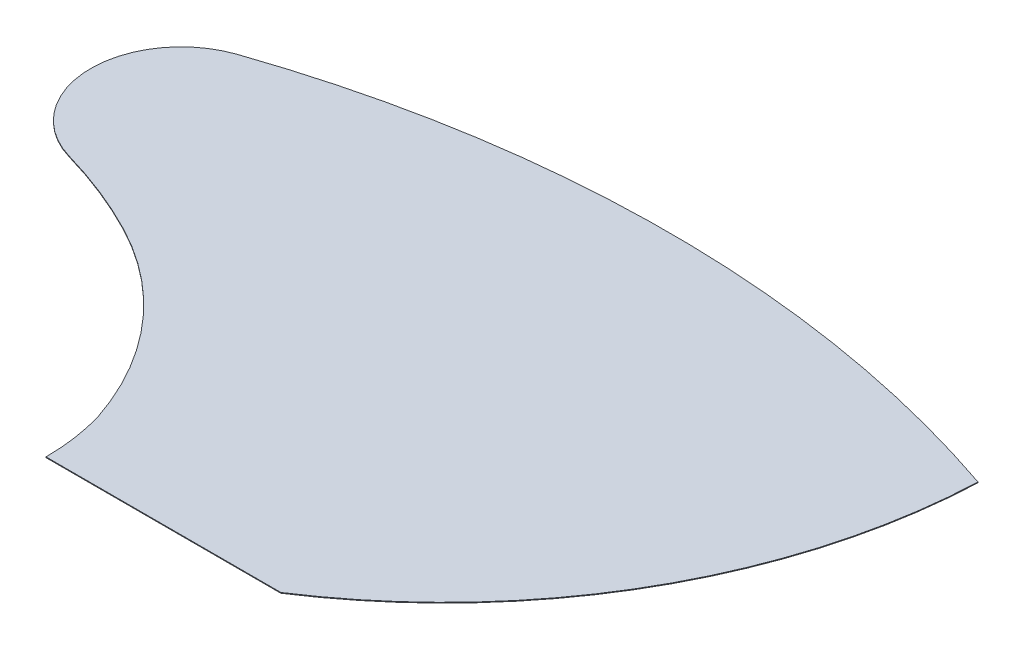
ISO-10303-21;
HEADER;
FILE_DESCRIPTION(('STEP AP214'),'2;1');
FILE_NAME('part.step','',(''),(''),'','','');
FILE_SCHEMA(('AUTOMOTIVE_DESIGN { 1 0 10303 214 1 1 1 1 }'));
ENDSEC;
DATA;
#1=APPLICATION_CONTEXT('core data for automotive mechanical design processes');
#2=APPLICATION_PROTOCOL_DEFINITION('international standard','automotive_design',2000,#1);
#3=PRODUCT_CONTEXT('',#1,'mechanical');
#4=PRODUCT('Part','Part','',(#3));
#5=PRODUCT_RELATED_PRODUCT_CATEGORY('part','',(#4));
#6=PRODUCT_DEFINITION_FORMATION('','',#4);
#7=PRODUCT_DEFINITION_CONTEXT('part definition',#1,'design');
#8=PRODUCT_DEFINITION('design','',#6,#7);
#9=PRODUCT_DEFINITION_SHAPE('','',#8);
#10=(LENGTH_UNIT() NAMED_UNIT(*) SI_UNIT(.MILLI.,.METRE.));
#11=(NAMED_UNIT(*) PLANE_ANGLE_UNIT() SI_UNIT($,.RADIAN.));
#12=(NAMED_UNIT(*) SI_UNIT($,.STERADIAN.) SOLID_ANGLE_UNIT());
#13=UNCERTAINTY_MEASURE_WITH_UNIT(LENGTH_MEASURE(1.E-05),#10,'distance_accuracy_value','');
#14=(GEOMETRIC_REPRESENTATION_CONTEXT(3) GLOBAL_UNCERTAINTY_ASSIGNED_CONTEXT((#13)) GLOBAL_UNIT_ASSIGNED_CONTEXT((#10,
#11,#12)) REPRESENTATION_CONTEXT('',''));
#15=CARTESIAN_POINT('',(0.,0.,0.));
#16=DIRECTION('',(0.,0.,1.));
#17=DIRECTION('',(1.,0.,0.));
#18=AXIS2_PLACEMENT_3D('',#15,#16,#17);
#19=CARTESIAN_POINT('',(57.9998082250812,0.2,-136.197081024861));
#20=DIRECTION('',(0.,-1.,0.));
#21=DIRECTION('',(0.,0.,-1.));
#22=AXIS2_PLACEMENT_3D('',#19,#20,#21);
#23=CYLINDRICAL_SURFACE('',#22,154.14);
#24=CARTESIAN_POINT('',(57.9998082250812,0.,-136.197081024861));
#25=DIRECTION('',(0.,1.,0.));
#26=DIRECTION('',(0.,0.,1.));
#27=AXIS2_PLACEMENT_3D('',#24,#25,#26);
#28=CIRCLE('',#27,154.14);
#29=CARTESIAN_POINT('',(142.011811156256,0.,-6.96425638850026));
#30=VERTEX_POINT('',#29);
#31=CARTESIAN_POINT('',(212.011811156255,0.,-129.916750370511));
#32=VERTEX_POINT('',#31);
#33=EDGE_CURVE('E123',#30,#32,#28,.T.);
#34=ORIENTED_EDGE('',*,*,#33,.T.);
#35=DIRECTION('',(0.,-1.,0.));
#36=VECTOR('',#35,1.);
#37=CARTESIAN_POINT('',(212.011811156255,0.2,-129.916750370511));
#38=LINE('',#37,#36);
#39=CARTESIAN_POINT('',(212.011811156255,0.2,-129.916750370511));
#40=VERTEX_POINT('',#39);
#41=EDGE_CURVE('E11',#40,#32,#38,.T.);
#42=ORIENTED_EDGE('',*,*,#41,.F.);
#43=CARTESIAN_POINT('',(57.9998082250812,0.2,-136.197081024861));
#44=DIRECTION('',(0.,1.,0.));
#45=DIRECTION('',(0.,0.,1.));
#46=AXIS2_PLACEMENT_3D('',#43,#44,#45);
#47=CIRCLE('',#46,154.14);
#48=CARTESIAN_POINT('',(142.011811156256,0.2,-6.96425638850026));
#49=VERTEX_POINT('',#48);
#50=EDGE_CURVE('E135',#49,#40,#47,.T.);
#51=ORIENTED_EDGE('',*,*,#50,.F.);
#52=DIRECTION('',(0.,-1.,0.));
#53=VECTOR('',#52,1.);
#54=CARTESIAN_POINT('',(142.011811156256,0.2,-6.96425638850026));
#55=LINE('',#54,#53);
#56=EDGE_CURVE('E119',#49,#30,#55,.T.);
#57=ORIENTED_EDGE('',*,*,#56,.T.);
#58=EDGE_LOOP('',(#34,#42,#51,#57));
#59=FACE_BOUND('',#58,.T.);
#60=ADVANCED_FACE('F33',(#59),#23,.T.);
#61=CARTESIAN_POINT('',(109.511811156256,0.2,169.7057436115));
#62=DIRECTION('',(0.,-1.,0.));
#63=DIRECTION('',(0.,0.,-1.));
#64=AXIS2_PLACEMENT_3D('',#61,#62,#63);
#65=CYLINDRICAL_SURFACE('',#64,316.67);
#66=CARTESIAN_POINT('',(109.511811156256,0.,169.7057436115));
#67=DIRECTION('',(0.,1.,0.));
#68=DIRECTION('',(0.,0.,-1.));
#69=AXIS2_PLACEMENT_3D('',#66,#67,#68);
#70=CIRCLE('',#69,316.67);
#71=CARTESIAN_POINT('',(7.01181115625558,0.,-129.916750370511));
#72=VERTEX_POINT('',#71);
#73=EDGE_CURVE('E126',#32,#72,#70,.T.);
#74=ORIENTED_EDGE('',*,*,#73,.T.);
#75=DIRECTION('',(0.,-1.,0.));
#76=VECTOR('',#75,1.);
#77=CARTESIAN_POINT('',(7.01181115625558,0.2,-129.916750370511));
#78=LINE('',#77,#76);
#79=CARTESIAN_POINT('',(7.01181115625558,0.2,-129.916750370511));
#80=VERTEX_POINT('',#79);
#81=EDGE_CURVE('E41',#80,#72,#78,.T.);
#82=ORIENTED_EDGE('',*,*,#81,.F.);
#83=CARTESIAN_POINT('',(109.511811156256,0.2,169.7057436115));
#84=DIRECTION('',(0.,1.,0.));
#85=DIRECTION('',(0.,0.,-1.));
#86=AXIS2_PLACEMENT_3D('',#83,#84,#85);
#87=CIRCLE('',#86,316.67);
#88=EDGE_CURVE('E89',#40,#80,#87,.T.);
#89=ORIENTED_EDGE('',*,*,#88,.F.);
#90=ORIENTED_EDGE('',*,*,#41,.T.);
#91=EDGE_LOOP('',(#74,#82,#89,#90));
#92=FACE_BOUND('',#91,.T.);
#93=ADVANCED_FACE('F160',(#92),#65,.T.);
#94=CARTESIAN_POINT('',(15.1038312402549,0.2,-106.26259194202));
#95=DIRECTION('',(0.,-1.,0.));
#96=DIRECTION('',(0.,0.,-1.));
#97=AXIS2_PLACEMENT_3D('',#94,#95,#96);
#98=CYLINDRICAL_SURFACE('',#97,25.0000000000001);
#99=CARTESIAN_POINT('',(15.1038312402549,0.,-106.26259194202));
#100=DIRECTION('',(0.,1.,0.));
#101=DIRECTION('',(0.,0.,1.));
#102=AXIS2_PLACEMENT_3D('',#99,#100,#101);
#103=CIRCLE('',#102,25.0000000000001);
#104=CARTESIAN_POINT('',(8.21697741221972,0.,-82.2298799778806));
#105=VERTEX_POINT('',#104);
#106=EDGE_CURVE('E128',#72,#105,#103,.T.);
#107=ORIENTED_EDGE('',*,*,#106,.T.);
#108=DIRECTION('',(0.,-1.,0.));
#109=VECTOR('',#108,1.);
#110=CARTESIAN_POINT('',(8.21697741221972,0.2,-82.2298799778806));
#111=LINE('',#110,#109);
#112=CARTESIAN_POINT('',(8.21697741221972,0.2,-82.2298799778806));
#113=VERTEX_POINT('',#112);
#114=EDGE_CURVE('E139',#113,#105,#111,.T.);
#115=ORIENTED_EDGE('',*,*,#114,.F.);
#116=CARTESIAN_POINT('',(15.1038312402549,0.2,-106.26259194202));
#117=DIRECTION('',(0.,1.,0.));
#118=DIRECTION('',(0.,0.,1.));
#119=AXIS2_PLACEMENT_3D('',#116,#117,#118);
#120=CIRCLE('',#119,25.0000000000001);
#121=EDGE_CURVE('E147',#80,#113,#120,.T.);
#122=ORIENTED_EDGE('',*,*,#121,.F.);
#123=ORIENTED_EDGE('',*,*,#81,.T.);
#124=EDGE_LOOP('',(#107,#115,#122,#123));
#125=FACE_BOUND('',#124,.T.);
#126=ADVANCED_FACE('F145',(#125),#98,.T.);
#127=CARTESIAN_POINT('',(-28.7929750596293,0.2,46.921914117406));
#128=DIRECTION('',(0.,-1.,0.));
#129=DIRECTION('',(0.,0.,-1.));
#130=AXIS2_PLACEMENT_3D('',#127,#128,#129);
#131=CYLINDRICAL_SURFACE('',#130,134.35);
#132=CARTESIAN_POINT('',(-28.7929750596293,0.,46.921914117406));
#133=DIRECTION('',(0.,-1.,0.));
#134=DIRECTION('',(0.,0.,-1.));
#135=AXIS2_PLACEMENT_3D('',#132,#133,#134);
#136=CIRCLE('',#135,134.35);
#137=CARTESIAN_POINT('',(33.0397764655305,0.,-72.3535374173827));
#138=VERTEX_POINT('',#137);
#139=EDGE_CURVE('E130',#105,#138,#136,.T.);
#140=ORIENTED_EDGE('',*,*,#139,.T.);
#141=DIRECTION('',(0.,-1.,0.));
#142=VECTOR('',#141,1.);
#143=CARTESIAN_POINT('',(33.0397764655305,0.2,-72.3535374173827));
#144=LINE('',#143,#142);
#145=CARTESIAN_POINT('',(33.0397764655305,0.2,-72.3535374173827));
#146=VERTEX_POINT('',#145);
#147=EDGE_CURVE('E114',#146,#138,#144,.T.);
#148=ORIENTED_EDGE('',*,*,#147,.F.);
#149=CARTESIAN_POINT('',(-28.7929750596293,0.2,46.921914117406));
#150=DIRECTION('',(0.,-1.,0.));
#151=DIRECTION('',(0.,0.,-1.));
#152=AXIS2_PLACEMENT_3D('',#149,#150,#151);
#153=CIRCLE('',#152,134.35);
#154=EDGE_CURVE('E105',#113,#146,#153,.T.);
#155=ORIENTED_EDGE('',*,*,#154,.F.);
#156=ORIENTED_EDGE('',*,*,#114,.T.);
#157=EDGE_LOOP('',(#140,#148,#155,#156));
#158=FACE_BOUND('',#157,.T.);
#159=ADVANCED_FACE('F153',(#158),#131,.F.);
#160=CARTESIAN_POINT('',(-6.13554031765866,0.2,3.21569544187793));
#161=DIRECTION('',(0.,-1.,0.));
#162=DIRECTION('',(0.,0.,-1.));
#163=AXIS2_PLACEMENT_3D('',#160,#161,#162);
#164=CYLINDRICAL_SURFACE('',#163,85.1200000000012);
#165=CARTESIAN_POINT('',(-6.13554031765866,0.,3.21569544187793));
#166=DIRECTION('',(0.,-1.,0.));
#167=DIRECTION('',(0.,0.,-1.));
#168=AXIS2_PLACEMENT_3D('',#165,#166,#167);
#169=CIRCLE('',#168,85.1200000000012);
#170=CARTESIAN_POINT('',(74.6261493355837,0.,-23.6722922915612));
#171=VERTEX_POINT('',#170);
#172=EDGE_CURVE('E113',#138,#171,#169,.T.);
#173=ORIENTED_EDGE('',*,*,#172,.T.);
#174=DIRECTION('',(0.,-1.,0.));
#175=VECTOR('',#174,1.);
#176=CARTESIAN_POINT('',(74.6261493355837,0.2,-23.6722922915612));
#177=LINE('',#176,#175);
#178=CARTESIAN_POINT('',(74.6261493355837,0.2,-23.6722922915612));
#179=VERTEX_POINT('',#178);
#180=EDGE_CURVE('E110',#179,#171,#177,.T.);
#181=ORIENTED_EDGE('',*,*,#180,.F.);
#182=CARTESIAN_POINT('',(-6.13554031765866,0.2,3.21569544187793));
#183=DIRECTION('',(0.,-1.,0.));
#184=DIRECTION('',(0.,0.,-1.));
#185=AXIS2_PLACEMENT_3D('',#182,#183,#184);
#186=CIRCLE('',#185,85.1200000000012);
#187=EDGE_CURVE('E99',#146,#179,#186,.T.);
#188=ORIENTED_EDGE('',*,*,#187,.F.);
#189=ORIENTED_EDGE('',*,*,#147,.T.);
#190=EDGE_LOOP('',(#173,#181,#188,#189));
#191=FACE_BOUND('',#190,.T.);
#192=ADVANCED_FACE('F111',(#191),#164,.F.);
#193=CARTESIAN_POINT('',(16.9018396065768,0.2,-6.90577308482571));
#194=DIRECTION('',(0.,-1.,0.));
#195=DIRECTION('',(0.,0.,-1.));
#196=AXIS2_PLACEMENT_3D('',#193,#194,#195);
#197=CYLINDRICAL_SURFACE('',#196,60.11);
#198=CARTESIAN_POINT('',(16.9018396065768,0.,-6.90577308482571));
#199=DIRECTION('',(0.,-1.,0.));
#200=DIRECTION('',(0.,0.,-1.));
#201=AXIS2_PLACEMENT_3D('',#198,#199,#200);
#202=CIRCLE('',#201,60.11);
#203=CARTESIAN_POINT('',(77.0118111562556,0.,-6.96425638850027));
#204=VERTEX_POINT('',#203);
#205=EDGE_CURVE('E75',#171,#204,#202,.T.);
#206=ORIENTED_EDGE('',*,*,#205,.T.);
#207=DIRECTION('',(0.,-1.,0.));
#208=VECTOR('',#207,1.);
#209=CARTESIAN_POINT('',(77.0118111562556,0.2,-6.96425638850027));
#210=LINE('',#209,#208);
#211=CARTESIAN_POINT('',(77.0118111562556,0.2,-6.96425638850027));
#212=VERTEX_POINT('',#211);
#213=EDGE_CURVE('E115',#212,#204,#210,.T.);
#214=ORIENTED_EDGE('',*,*,#213,.F.);
#215=CARTESIAN_POINT('',(16.9018396065768,0.2,-6.90577308482571));
#216=DIRECTION('',(0.,-1.,0.));
#217=DIRECTION('',(0.,0.,-1.));
#218=AXIS2_PLACEMENT_3D('',#215,#216,#217);
#219=CIRCLE('',#218,60.11);
#220=EDGE_CURVE('E103',#179,#212,#219,.T.);
#221=ORIENTED_EDGE('',*,*,#220,.F.);
#222=ORIENTED_EDGE('',*,*,#180,.T.);
#223=EDGE_LOOP('',(#206,#214,#221,#222));
#224=FACE_BOUND('',#223,.T.);
#225=ADVANCED_FACE('F117',(#224),#197,.F.);
#226=CARTESIAN_POINT('',(77.0118111562556,0.2,-6.96425638850026));
#227=DIRECTION('',(0.,0.,-1.));
#228=DIRECTION('',(-1.,0.,0.));
#229=AXIS2_PLACEMENT_3D('',#226,#227,#228);
#230=PLANE('',#229);
#231=DIRECTION('',(1.,0.,0.));
#232=VECTOR('',#231,1.);
#233=CARTESIAN_POINT('',(77.0118111562556,0.,-6.96425638850026));
#234=LINE('',#233,#232);
#235=EDGE_CURVE('E81',#204,#30,#234,.T.);
#236=ORIENTED_EDGE('',*,*,#235,.T.);
#237=ORIENTED_EDGE('',*,*,#56,.F.);
#238=DIRECTION('',(1.,0.,0.));
#239=VECTOR('',#238,1.);
#240=CARTESIAN_POINT('',(77.0118111562556,0.2,-6.96425638850026));
#241=LINE('',#240,#239);
#242=EDGE_CURVE('E49',#212,#49,#241,.T.);
#243=ORIENTED_EDGE('',*,*,#242,.F.);
#244=ORIENTED_EDGE('',*,*,#213,.T.);
#245=EDGE_LOOP('',(#236,#237,#243,#244));
#246=FACE_BOUND('',#245,.T.);
#247=ADVANCED_FACE('F174',(#246),#230,.F.);
#248=CARTESIAN_POINT('',(57.9998082250812,0.2,-136.197081024861));
#249=DIRECTION('',(0.,1.,0.));
#250=DIRECTION('',(0.,0.,1.));
#251=AXIS2_PLACEMENT_3D('',#248,#249,#250);
#252=PLANE('',#251);
#253=ORIENTED_EDGE('',*,*,#50,.T.);
#254=ORIENTED_EDGE('',*,*,#88,.T.);
#255=ORIENTED_EDGE('',*,*,#121,.T.);
#256=ORIENTED_EDGE('',*,*,#154,.T.);
#257=ORIENTED_EDGE('',*,*,#187,.T.);
#258=ORIENTED_EDGE('',*,*,#220,.T.);
#259=ORIENTED_EDGE('',*,*,#242,.T.);
#260=EDGE_LOOP('',(#253,#254,#255,#256,#257,#258,#259));
#261=FACE_BOUND('',#260,.T.);
#262=ADVANCED_FACE('F101',(#261),#252,.T.);
#263=CARTESIAN_POINT('',(57.9998082250812,0.,-136.197081024861));
#264=DIRECTION('',(0.,1.,0.));
#265=DIRECTION('',(0.,0.,1.));
#266=AXIS2_PLACEMENT_3D('',#263,#264,#265);
#267=PLANE('',#266);
#268=ORIENTED_EDGE('',*,*,#33,.F.);
#269=ORIENTED_EDGE('',*,*,#235,.F.);
#270=ORIENTED_EDGE('',*,*,#205,.F.);
#271=ORIENTED_EDGE('',*,*,#172,.F.);
#272=ORIENTED_EDGE('',*,*,#139,.F.);
#273=ORIENTED_EDGE('',*,*,#106,.F.);
#274=ORIENTED_EDGE('',*,*,#73,.F.);
#275=EDGE_LOOP('',(#268,#269,#270,#271,#272,#273,#274));
#276=FACE_BOUND('',#275,.T.);
#277=ADVANCED_FACE('F151',(#276),#267,.F.);
#278=CLOSED_SHELL('',(#60,#93,#126,#159,#192,#225,#247,#262,#277));
#279=MANIFOLD_SOLID_BREP('B2',#278);
#280=ADVANCED_BREP_SHAPE_REPRESENTATION('',(#18,#279),#14);
#281=SHAPE_DEFINITION_REPRESENTATION(#9,#280);
ENDSEC;
END-ISO-10303-21;
